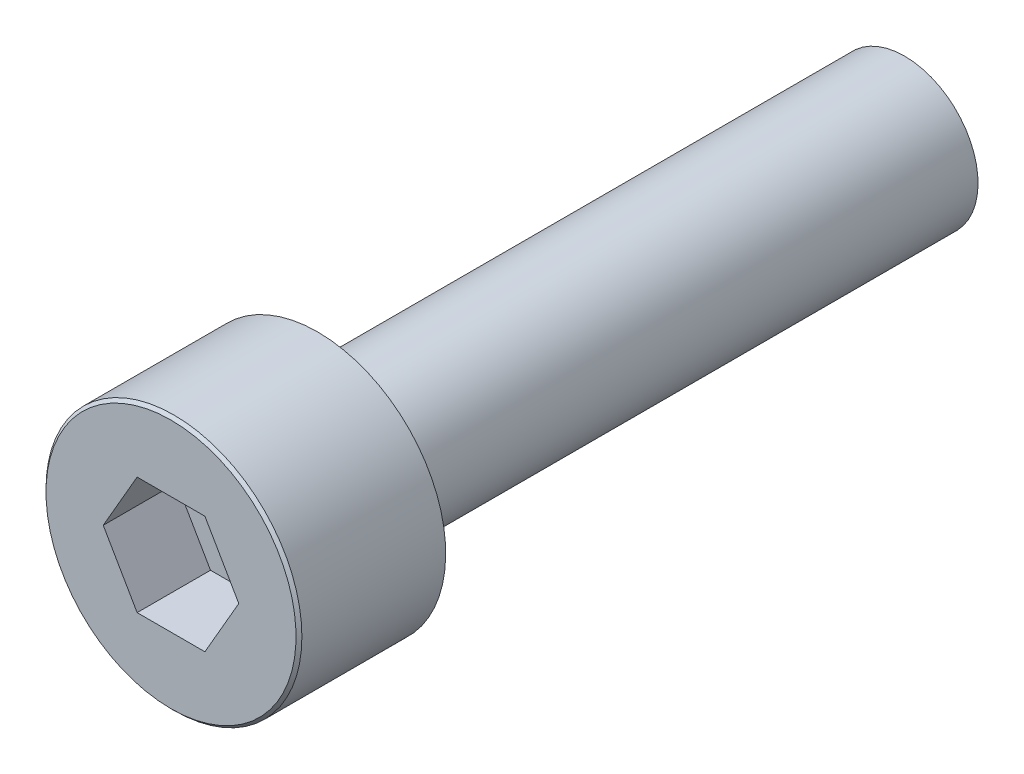
ISO-10303-21;
HEADER;
FILE_DESCRIPTION(('STEP AP214'),'2;1');
FILE_NAME('part.step','',(''),(''),'','','');
FILE_SCHEMA(('AUTOMOTIVE_DESIGN { 1 0 10303 214 1 1 1 1 }'));
ENDSEC;
DATA;
#1=APPLICATION_CONTEXT('core data for automotive mechanical design processes');
#2=APPLICATION_PROTOCOL_DEFINITION('international standard','automotive_design',2000,#1);
#3=PRODUCT_CONTEXT('',#1,'mechanical');
#4=PRODUCT('Part','Part','',(#3));
#5=PRODUCT_RELATED_PRODUCT_CATEGORY('part','',(#4));
#6=PRODUCT_DEFINITION_FORMATION('','',#4);
#7=PRODUCT_DEFINITION_CONTEXT('part definition',#1,'design');
#8=PRODUCT_DEFINITION('design','',#6,#7);
#9=PRODUCT_DEFINITION_SHAPE('','',#8);
#10=(LENGTH_UNIT() NAMED_UNIT(*) SI_UNIT(.MILLI.,.METRE.));
#11=(NAMED_UNIT(*) PLANE_ANGLE_UNIT() SI_UNIT($,.RADIAN.));
#12=(NAMED_UNIT(*) SI_UNIT($,.STERADIAN.) SOLID_ANGLE_UNIT());
#13=UNCERTAINTY_MEASURE_WITH_UNIT(LENGTH_MEASURE(1.E-05),#10,'distance_accuracy_value','');
#14=(GEOMETRIC_REPRESENTATION_CONTEXT(3) GLOBAL_UNCERTAINTY_ASSIGNED_CONTEXT((#13)) GLOBAL_UNIT_ASSIGNED_CONTEXT((#10,
#11,#12)) REPRESENTATION_CONTEXT('',''));
#15=CARTESIAN_POINT('',(0.,0.,0.));
#16=DIRECTION('',(0.,0.,1.));
#17=DIRECTION('',(1.,0.,0.));
#18=AXIS2_PLACEMENT_3D('',#15,#16,#17);
#19=CARTESIAN_POINT('',(0.,0.,0.));
#20=DIRECTION('',(0.,0.,1.));
#21=DIRECTION('',(0.,-1.,0.));
#22=AXIS2_PLACEMENT_3D('',#19,#20,#21);
#23=PLANE('',#22);
#24=CARTESIAN_POINT('',(0.,0.,0.));
#25=DIRECTION('',(0.,0.,1.));
#26=DIRECTION('',(0.,-1.,0.));
#27=AXIS2_PLACEMENT_3D('',#24,#25,#26);
#28=CIRCLE('',#27,4.26);
#29=CARTESIAN_POINT('',(0.,-4.26,0.));
#30=VERTEX_POINT('',#29);
#31=EDGE_CURVE('E11',#30,#30,#28,.T.);
#32=ORIENTED_EDGE('',*,*,#31,.T.);
#33=EDGE_LOOP('',(#32));
#34=FACE_BOUND('',#33,.T.);
#35=DIRECTION('',(-0.5,0.866025403784438,0.));
#36=VECTOR('',#35,1.);
#37=CARTESIAN_POINT('',(2.3094010767585,0.,0.));
#38=LINE('',#37,#36);
#39=CARTESIAN_POINT('',(2.3094010767585,0.,0.));
#40=VERTEX_POINT('',#39);
#41=CARTESIAN_POINT('',(1.15470053837925,2.,0.));
#42=VERTEX_POINT('',#41);
#43=EDGE_CURVE('E56',#40,#42,#38,.T.);
#44=ORIENTED_EDGE('',*,*,#43,.F.);
#45=DIRECTION('',(0.5,0.866025403784438,0.));
#46=VECTOR('',#45,1.);
#47=CARTESIAN_POINT('',(1.15470053837925,-2.,0.));
#48=LINE('',#47,#46);
#49=CARTESIAN_POINT('',(1.15470053837925,-2.,0.));
#50=VERTEX_POINT('',#49);
#51=EDGE_CURVE('E139',#50,#40,#48,.T.);
#52=ORIENTED_EDGE('',*,*,#51,.F.);
#53=DIRECTION('',(1.,0.,0.));
#54=VECTOR('',#53,1.);
#55=CARTESIAN_POINT('',(-1.15470053837925,-2.,0.));
#56=LINE('',#55,#54);
#57=CARTESIAN_POINT('',(-1.15470053837925,-2.,0.));
#58=VERTEX_POINT('',#57);
#59=EDGE_CURVE('E137',#58,#50,#56,.T.);
#60=ORIENTED_EDGE('',*,*,#59,.F.);
#61=DIRECTION('',(0.5,-0.866025403784439,0.));
#62=VECTOR('',#61,1.);
#63=CARTESIAN_POINT('',(-2.3094010767585,0.,0.));
#64=LINE('',#63,#62);
#65=CARTESIAN_POINT('',(-2.3094010767585,0.,0.));
#66=VERTEX_POINT('',#65);
#67=EDGE_CURVE('E104',#66,#58,#64,.T.);
#68=ORIENTED_EDGE('',*,*,#67,.F.);
#69=DIRECTION('',(-0.5,-0.866025403784438,0.));
#70=VECTOR('',#69,1.);
#71=CARTESIAN_POINT('',(-1.15470053837925,2.,0.));
#72=LINE('',#71,#70);
#73=CARTESIAN_POINT('',(-1.15470053837925,2.,0.));
#74=VERTEX_POINT('',#73);
#75=EDGE_CURVE('E133',#74,#66,#72,.T.);
#76=ORIENTED_EDGE('',*,*,#75,.F.);
#77=DIRECTION('',(-1.,0.,0.));
#78=VECTOR('',#77,1.);
#79=CARTESIAN_POINT('',(1.15470053837925,2.,0.));
#80=LINE('',#79,#78);
#81=EDGE_CURVE('E130',#42,#74,#80,.T.);
#82=ORIENTED_EDGE('',*,*,#81,.F.);
#83=EDGE_LOOP('',(#44,#52,#60,#68,#76,#82));
#84=FACE_BOUND('',#83,.T.);
#85=ADVANCED_FACE('F40',(#34,#84),#23,.T.);
#86=CARTESIAN_POINT('',(0.,0.,-25.));
#87=DIRECTION('',(0.,0.,-1.));
#88=DIRECTION('',(0.,1.,0.));
#89=AXIS2_PLACEMENT_3D('',#86,#87,#88);
#90=CYLINDRICAL_SURFACE('',#89,4.36);
#91=CARTESIAN_POINT('',(0.,0.,-0.0999999999999994));
#92=DIRECTION('',(0.,0.,1.));
#93=DIRECTION('',(0.,-1.,0.));
#94=AXIS2_PLACEMENT_3D('',#91,#92,#93);
#95=CIRCLE('',#94,4.36);
#96=CARTESIAN_POINT('',(0.,-4.36,-0.1));
#97=VERTEX_POINT('',#96);
#98=EDGE_CURVE('E49',#97,#97,#95,.F.);
#99=ORIENTED_EDGE('',*,*,#98,.T.);
#100=EDGE_LOOP('',(#99));
#101=FACE_BOUND('',#100,.T.);
#102=CARTESIAN_POINT('',(0.,0.,-5.));
#103=DIRECTION('',(0.,0.,-1.));
#104=DIRECTION('',(0.,1.,0.));
#105=AXIS2_PLACEMENT_3D('',#102,#103,#104);
#106=CIRCLE('',#105,4.36);
#107=CARTESIAN_POINT('',(0.,4.36,-5.));
#108=VERTEX_POINT('',#107);
#109=EDGE_CURVE('E154',#108,#108,#106,.T.);
#110=ORIENTED_EDGE('',*,*,#109,.F.);
#111=EDGE_LOOP('',(#110));
#112=FACE_BOUND('',#111,.T.);
#113=ADVANCED_FACE('F159',(#101,#112),#90,.T.);
#114=CARTESIAN_POINT('',(0.,4.36,-5.));
#115=DIRECTION('',(0.,0.,-1.));
#116=DIRECTION('',(0.,1.,0.));
#117=AXIS2_PLACEMENT_3D('',#114,#115,#116);
#118=PLANE('',#117);
#119=ORIENTED_EDGE('',*,*,#109,.T.);
#120=EDGE_LOOP('',(#119));
#121=FACE_BOUND('',#120,.T.);
#122=CARTESIAN_POINT('',(0.,0.,-5.));
#123=DIRECTION('',(0.,0.,-1.));
#124=DIRECTION('',(0.,1.,0.));
#125=AXIS2_PLACEMENT_3D('',#122,#123,#124);
#126=CIRCLE('',#125,2.5);
#127=CARTESIAN_POINT('',(0.,2.5,-5.));
#128=VERTEX_POINT('',#127);
#129=EDGE_CURVE('E151',#128,#128,#126,.T.);
#130=ORIENTED_EDGE('',*,*,#129,.F.);
#131=EDGE_LOOP('',(#130));
#132=FACE_BOUND('',#131,.T.);
#133=ADVANCED_FACE('F175',(#121,#132),#118,.T.);
#134=CARTESIAN_POINT('',(0.,0.,-25.));
#135=DIRECTION('',(0.,0.,-1.));
#136=DIRECTION('',(0.,1.,0.));
#137=AXIS2_PLACEMENT_3D('',#134,#135,#136);
#138=CYLINDRICAL_SURFACE('',#137,2.5);
#139=ORIENTED_EDGE('',*,*,#129,.T.);
#140=EDGE_LOOP('',(#139));
#141=FACE_BOUND('',#140,.T.);
#142=CARTESIAN_POINT('',(0.,0.,-25.));
#143=DIRECTION('',(0.,0.,-1.));
#144=DIRECTION('',(0.,1.,0.));
#145=AXIS2_PLACEMENT_3D('',#142,#143,#144);
#146=CIRCLE('',#145,2.49999999999999);
#147=CARTESIAN_POINT('',(0.,2.5,-25.));
#148=VERTEX_POINT('',#147);
#149=EDGE_CURVE('E143',#148,#148,#146,.T.);
#150=ORIENTED_EDGE('',*,*,#149,.F.);
#151=EDGE_LOOP('',(#150));
#152=FACE_BOUND('',#151,.T.);
#153=ADVANCED_FACE('F181',(#141,#152),#138,.T.);
#154=CARTESIAN_POINT('',(0.,2.5,-25.));
#155=DIRECTION('',(0.,0.,-1.));
#156=DIRECTION('',(0.,1.,0.));
#157=AXIS2_PLACEMENT_3D('',#154,#155,#156);
#158=PLANE('',#157);
#159=ORIENTED_EDGE('',*,*,#149,.T.);
#160=EDGE_LOOP('',(#159));
#161=FACE_BOUND('',#160,.T.);
#162=ADVANCED_FACE('F185',(#161),#158,.T.);
#163=CARTESIAN_POINT('',(2.3094010767585,0.,-2.5));
#164=DIRECTION('',(0.866025403784438,0.5,0.));
#165=DIRECTION('',(-0.5,0.866025403784439,0.));
#166=AXIS2_PLACEMENT_3D('',#163,#164,#165);
#167=PLANE('',#166);
#168=ORIENTED_EDGE('',*,*,#43,.T.);
#169=DIRECTION('',(0.,0.,1.));
#170=VECTOR('',#169,1.);
#171=CARTESIAN_POINT('',(1.15470053837925,2.,-2.5));
#172=LINE('',#171,#170);
#173=CARTESIAN_POINT('',(1.15470053837925,2.,-2.5));
#174=VERTEX_POINT('',#173);
#175=EDGE_CURVE('E86',#174,#42,#172,.T.);
#176=ORIENTED_EDGE('',*,*,#175,.F.);
#177=DIRECTION('',(-0.5,0.866025403784438,0.));
#178=VECTOR('',#177,1.);
#179=CARTESIAN_POINT('',(2.3094010767585,0.,-2.5));
#180=LINE('',#179,#178);
#181=CARTESIAN_POINT('',(2.3094010767585,0.,-2.5));
#182=VERTEX_POINT('',#181);
#183=EDGE_CURVE('E141',#182,#174,#180,.T.);
#184=ORIENTED_EDGE('',*,*,#183,.F.);
#185=DIRECTION('',(0.,0.,1.));
#186=VECTOR('',#185,1.);
#187=CARTESIAN_POINT('',(2.3094010767585,0.,-2.5));
#188=LINE('',#187,#186);
#189=EDGE_CURVE('E64',#182,#40,#188,.T.);
#190=ORIENTED_EDGE('',*,*,#189,.T.);
#191=EDGE_LOOP('',(#168,#176,#184,#190));
#192=FACE_BOUND('',#191,.T.);
#193=ADVANCED_FACE('F189',(#192),#167,.F.);
#194=CARTESIAN_POINT('',(1.15470053837925,-2.,-2.5));
#195=DIRECTION('',(0.866025403784438,-0.5,0.));
#196=DIRECTION('',(0.5,0.866025403784439,0.));
#197=AXIS2_PLACEMENT_3D('',#194,#195,#196);
#198=PLANE('',#197);
#199=ORIENTED_EDGE('',*,*,#51,.T.);
#200=ORIENTED_EDGE('',*,*,#189,.F.);
#201=DIRECTION('',(0.5,0.866025403784438,0.));
#202=VECTOR('',#201,1.);
#203=CARTESIAN_POINT('',(1.15470053837925,-2.,-2.5));
#204=LINE('',#203,#202);
#205=CARTESIAN_POINT('',(1.15470053837925,-2.,-2.5));
#206=VERTEX_POINT('',#205);
#207=EDGE_CURVE('E116',#206,#182,#204,.T.);
#208=ORIENTED_EDGE('',*,*,#207,.F.);
#209=DIRECTION('',(0.,0.,1.));
#210=VECTOR('',#209,1.);
#211=CARTESIAN_POINT('',(1.15470053837925,-2.,-2.5));
#212=LINE('',#211,#210);
#213=EDGE_CURVE('E108',#206,#50,#212,.T.);
#214=ORIENTED_EDGE('',*,*,#213,.T.);
#215=EDGE_LOOP('',(#199,#200,#208,#214));
#216=FACE_BOUND('',#215,.T.);
#217=ADVANCED_FACE('F193',(#216),#198,.F.);
#218=CARTESIAN_POINT('',(-1.15470053837925,-2.,-2.5));
#219=DIRECTION('',(0.,-1.,0.));
#220=DIRECTION('',(0.,0.,-1.));
#221=AXIS2_PLACEMENT_3D('',#218,#219,#220);
#222=PLANE('',#221);
#223=ORIENTED_EDGE('',*,*,#59,.T.);
#224=ORIENTED_EDGE('',*,*,#213,.F.);
#225=DIRECTION('',(1.,0.,0.));
#226=VECTOR('',#225,1.);
#227=CARTESIAN_POINT('',(-1.15470053837925,-2.,-2.5));
#228=LINE('',#227,#226);
#229=CARTESIAN_POINT('',(-1.15470053837925,-2.,-2.5));
#230=VERTEX_POINT('',#229);
#231=EDGE_CURVE('E112',#230,#206,#228,.T.);
#232=ORIENTED_EDGE('',*,*,#231,.F.);
#233=DIRECTION('',(0.,0.,1.));
#234=VECTOR('',#233,1.);
#235=CARTESIAN_POINT('',(-1.15470053837925,-2.,-2.5));
#236=LINE('',#235,#234);
#237=EDGE_CURVE('E97',#230,#58,#236,.T.);
#238=ORIENTED_EDGE('',*,*,#237,.T.);
#239=EDGE_LOOP('',(#223,#224,#232,#238));
#240=FACE_BOUND('',#239,.T.);
#241=ADVANCED_FACE('F113',(#240),#222,.F.);
#242=CARTESIAN_POINT('',(-2.3094010767585,0.,-2.5));
#243=DIRECTION('',(-0.866025403784439,-0.5,0.));
#244=DIRECTION('',(0.5,-0.866025403784439,0.));
#245=AXIS2_PLACEMENT_3D('',#242,#243,#244);
#246=PLANE('',#245);
#247=ORIENTED_EDGE('',*,*,#67,.T.);
#248=ORIENTED_EDGE('',*,*,#237,.F.);
#249=DIRECTION('',(0.5,-0.866025403784439,0.));
#250=VECTOR('',#249,1.);
#251=CARTESIAN_POINT('',(-2.3094010767585,0.,-2.5));
#252=LINE('',#251,#250);
#253=CARTESIAN_POINT('',(-2.3094010767585,0.,-2.5));
#254=VERTEX_POINT('',#253);
#255=EDGE_CURVE('E101',#254,#230,#252,.T.);
#256=ORIENTED_EDGE('',*,*,#255,.F.);
#257=DIRECTION('',(0.,0.,1.));
#258=VECTOR('',#257,1.);
#259=CARTESIAN_POINT('',(-2.3094010767585,0.,-2.5));
#260=LINE('',#259,#258);
#261=EDGE_CURVE('E109',#254,#66,#260,.T.);
#262=ORIENTED_EDGE('',*,*,#261,.T.);
#263=EDGE_LOOP('',(#247,#248,#256,#262));
#264=FACE_BOUND('',#263,.T.);
#265=ADVANCED_FACE('F99',(#264),#246,.F.);
#266=CARTESIAN_POINT('',(-1.15470053837925,2.,-2.5));
#267=DIRECTION('',(-0.866025403784439,0.5,0.));
#268=DIRECTION('',(-0.5,-0.866025403784439,0.));
#269=AXIS2_PLACEMENT_3D('',#266,#267,#268);
#270=PLANE('',#269);
#271=ORIENTED_EDGE('',*,*,#75,.T.);
#272=ORIENTED_EDGE('',*,*,#261,.F.);
#273=DIRECTION('',(-0.5,-0.866025403784438,0.));
#274=VECTOR('',#273,1.);
#275=CARTESIAN_POINT('',(-1.15470053837925,2.,-2.5));
#276=LINE('',#275,#274);
#277=CARTESIAN_POINT('',(-1.15470053837925,2.,-2.5));
#278=VERTEX_POINT('',#277);
#279=EDGE_CURVE('E122',#278,#254,#276,.T.);
#280=ORIENTED_EDGE('',*,*,#279,.F.);
#281=DIRECTION('',(0.,0.,1.));
#282=VECTOR('',#281,1.);
#283=CARTESIAN_POINT('',(-1.15470053837925,2.,-2.5));
#284=LINE('',#283,#282);
#285=EDGE_CURVE('E146',#278,#74,#284,.T.);
#286=ORIENTED_EDGE('',*,*,#285,.T.);
#287=EDGE_LOOP('',(#271,#272,#280,#286));
#288=FACE_BOUND('',#287,.T.);
#289=ADVANCED_FACE('F196',(#288),#270,.F.);
#290=CARTESIAN_POINT('',(1.15470053837925,2.,-2.5));
#291=DIRECTION('',(0.,1.,0.));
#292=DIRECTION('',(-1.,0.,0.));
#293=AXIS2_PLACEMENT_3D('',#290,#291,#292);
#294=PLANE('',#293);
#295=ORIENTED_EDGE('',*,*,#81,.T.);
#296=ORIENTED_EDGE('',*,*,#285,.F.);
#297=DIRECTION('',(-1.,0.,0.));
#298=VECTOR('',#297,1.);
#299=CARTESIAN_POINT('',(1.15470053837925,2.,-2.5));
#300=LINE('',#299,#298);
#301=EDGE_CURVE('E124',#174,#278,#300,.T.);
#302=ORIENTED_EDGE('',*,*,#301,.F.);
#303=ORIENTED_EDGE('',*,*,#175,.T.);
#304=EDGE_LOOP('',(#295,#296,#302,#303));
#305=FACE_BOUND('',#304,.T.);
#306=ADVANCED_FACE('F167',(#305),#294,.F.);
#307=CARTESIAN_POINT('',(0.,0.,-2.5));
#308=DIRECTION('',(0.,0.,1.));
#309=DIRECTION('',(1.,0.,0.));
#310=AXIS2_PLACEMENT_3D('',#307,#308,#309);
#311=PLANE('',#310);
#312=ORIENTED_EDGE('',*,*,#183,.T.);
#313=ORIENTED_EDGE('',*,*,#301,.T.);
#314=ORIENTED_EDGE('',*,*,#279,.T.);
#315=ORIENTED_EDGE('',*,*,#255,.T.);
#316=ORIENTED_EDGE('',*,*,#231,.T.);
#317=ORIENTED_EDGE('',*,*,#207,.T.);
#318=EDGE_LOOP('',(#312,#313,#314,#315,#316,#317));
#319=FACE_BOUND('',#318,.T.);
#320=ADVANCED_FACE('F119',(#319),#311,.T.);
#321=CARTESIAN_POINT('',(0.,0.,-0.0999999999999994));
#322=DIRECTION('',(0.,0.,-1.));
#323=DIRECTION('',(0.,1.,0.));
#324=AXIS2_PLACEMENT_3D('',#321,#322,#323);
#325=CONICAL_SURFACE('',#324,4.36,0.785398163397453);
#326=ORIENTED_EDGE('',*,*,#31,.F.);
#327=EDGE_LOOP('',(#326));
#328=FACE_BOUND('',#327,.T.);
#329=ORIENTED_EDGE('',*,*,#98,.F.);
#330=EDGE_LOOP('',(#329));
#331=FACE_BOUND('',#330,.T.);
#332=ADVANCED_FACE('F43',(#328,#331),#325,.T.);
#333=CLOSED_SHELL('',(#85,#113,#133,#153,#162,#193,#217,#241,#265,#289,#306,#320,#332));
#334=MANIFOLD_SOLID_BREP('B2',#333);
#335=ADVANCED_BREP_SHAPE_REPRESENTATION('',(#18,#334),#14);
#336=SHAPE_DEFINITION_REPRESENTATION(#9,#335);
ENDSEC;
END-ISO-10303-21;
